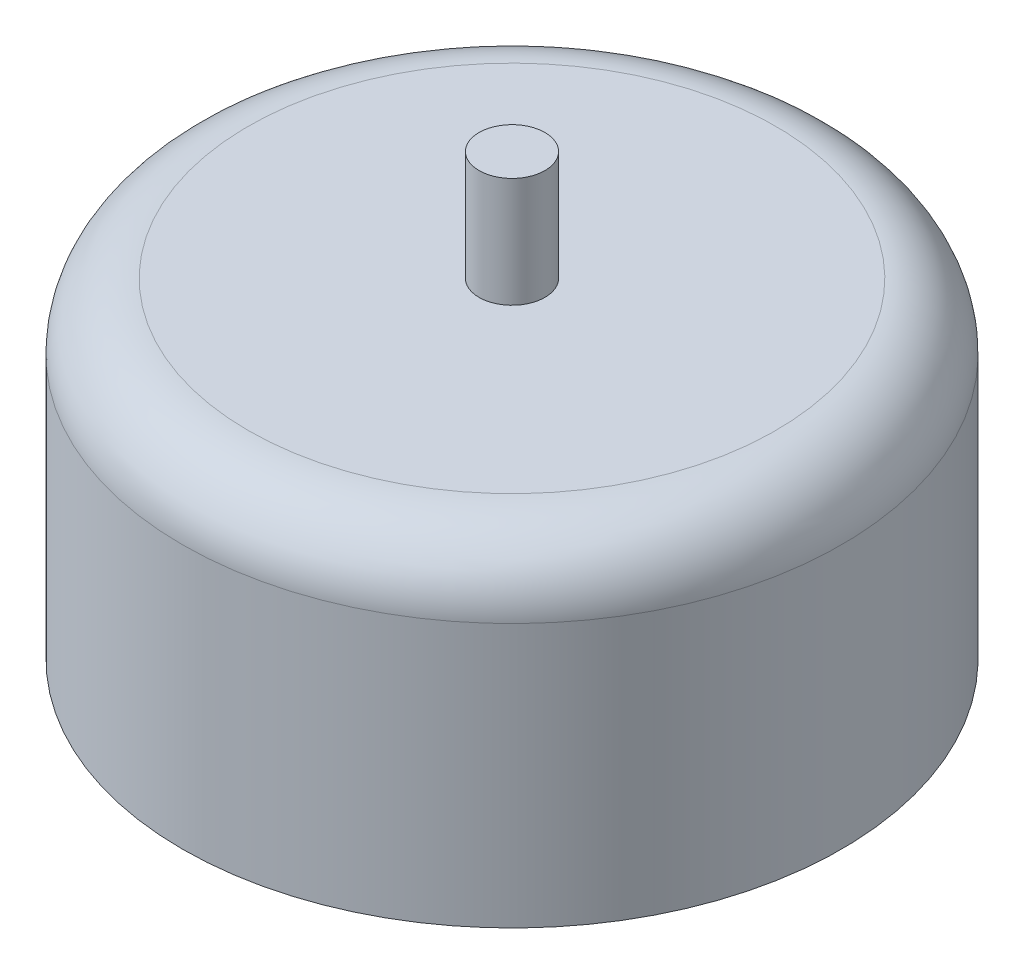
ISO-10303-21;
HEADER;
FILE_DESCRIPTION(('STEP AP214'),'2;1');
FILE_NAME('part.step','',(''),(''),'','','');
FILE_SCHEMA(('AUTOMOTIVE_DESIGN { 1 0 10303 214 1 1 1 1 }'));
ENDSEC;
DATA;
#1=APPLICATION_CONTEXT('core data for automotive mechanical design processes');
#2=APPLICATION_PROTOCOL_DEFINITION('international standard','automotive_design',2000,#1);
#3=PRODUCT_CONTEXT('',#1,'mechanical');
#4=PRODUCT('Part','Part','',(#3));
#5=PRODUCT_RELATED_PRODUCT_CATEGORY('part','',(#4));
#6=PRODUCT_DEFINITION_FORMATION('','',#4);
#7=PRODUCT_DEFINITION_CONTEXT('part definition',#1,'design');
#8=PRODUCT_DEFINITION('design','',#6,#7);
#9=PRODUCT_DEFINITION_SHAPE('','',#8);
#10=(LENGTH_UNIT() NAMED_UNIT(*) SI_UNIT(.MILLI.,.METRE.));
#11=(NAMED_UNIT(*) PLANE_ANGLE_UNIT() SI_UNIT($,.RADIAN.));
#12=(NAMED_UNIT(*) SI_UNIT($,.STERADIAN.) SOLID_ANGLE_UNIT());
#13=UNCERTAINTY_MEASURE_WITH_UNIT(LENGTH_MEASURE(1.E-05),#10,'distance_accuracy_value','');
#14=(GEOMETRIC_REPRESENTATION_CONTEXT(3) GLOBAL_UNCERTAINTY_ASSIGNED_CONTEXT((#13)) GLOBAL_UNIT_ASSIGNED_CONTEXT((#10,
#11,#12)) REPRESENTATION_CONTEXT('',''));
#15=CARTESIAN_POINT('',(0.,0.,0.));
#16=DIRECTION('',(0.,0.,1.));
#17=DIRECTION('',(1.,0.,0.));
#18=AXIS2_PLACEMENT_3D('',#15,#16,#17);
#19=CARTESIAN_POINT('',(0.,15.,0.));
#20=DIRECTION('',(0.,-1.,0.));
#21=DIRECTION('',(0.,0.,-1.));
#22=AXIS2_PLACEMENT_3D('',#19,#20,#21);
#23=CYLINDRICAL_SURFACE('',#22,15.);
#24=CARTESIAN_POINT('',(0.,12.,0.));
#25=DIRECTION('',(0.,1.,0.));
#26=DIRECTION('',(0.,0.,1.));
#27=AXIS2_PLACEMENT_3D('',#24,#25,#26);
#28=CIRCLE('',#27,15.);
#29=CARTESIAN_POINT('',(0.,12.,15.));
#30=VERTEX_POINT('',#29);
#31=EDGE_CURVE('E61',#30,#30,#28,.F.);
#32=ORIENTED_EDGE('',*,*,#31,.T.);
#33=EDGE_LOOP('',(#32));
#34=FACE_BOUND('',#33,.T.);
#35=CARTESIAN_POINT('',(0.,0.,0.));
#36=DIRECTION('',(0.,1.,0.));
#37=DIRECTION('',(0.,0.,1.));
#38=AXIS2_PLACEMENT_3D('',#35,#36,#37);
#39=CIRCLE('',#38,15.);
#40=CARTESIAN_POINT('',(0.,0.,15.));
#41=VERTEX_POINT('',#40);
#42=EDGE_CURVE('E69',#41,#41,#39,.T.);
#43=ORIENTED_EDGE('',*,*,#42,.T.);
#44=EDGE_LOOP('',(#43));
#45=FACE_BOUND('',#44,.T.);
#46=ADVANCED_FACE('F37',(#34,#45),#23,.T.);
#47=CARTESIAN_POINT('',(0.,15.,0.));
#48=DIRECTION('',(0.,1.,0.));
#49=DIRECTION('',(0.,0.,1.));
#50=AXIS2_PLACEMENT_3D('',#47,#48,#49);
#51=PLANE('',#50);
#52=CARTESIAN_POINT('',(0.,15.,0.));
#53=DIRECTION('',(0.,1.,0.));
#54=DIRECTION('',(0.,0.,1.));
#55=AXIS2_PLACEMENT_3D('',#52,#53,#54);
#56=CIRCLE('',#55,1.5);
#57=CARTESIAN_POINT('',(0.,15.,1.5));
#58=VERTEX_POINT('',#57);
#59=EDGE_CURVE('E74',#58,#58,#56,.T.);
#60=ORIENTED_EDGE('',*,*,#59,.F.);
#61=EDGE_LOOP('',(#60));
#62=FACE_BOUND('',#61,.T.);
#63=CARTESIAN_POINT('',(0.,15.,0.));
#64=DIRECTION('',(0.,1.,0.));
#65=DIRECTION('',(0.,0.,1.));
#66=AXIS2_PLACEMENT_3D('',#63,#64,#65);
#67=CIRCLE('',#66,12.);
#68=CARTESIAN_POINT('',(0.,15.,12.));
#69=VERTEX_POINT('',#68);
#70=EDGE_CURVE('E65',#69,#69,#67,.T.);
#71=ORIENTED_EDGE('',*,*,#70,.T.);
#72=EDGE_LOOP('',(#71));
#73=FACE_BOUND('',#72,.T.);
#74=ADVANCED_FACE('F113',(#62,#73),#51,.T.);
#75=CARTESIAN_POINT('',(0.,0.,0.));
#76=DIRECTION('',(0.,1.,0.));
#77=DIRECTION('',(0.,0.,1.));
#78=AXIS2_PLACEMENT_3D('',#75,#76,#77);
#79=PLANE('',#78);
#80=CARTESIAN_POINT('',(0.,0.,-5.));
#81=DIRECTION('',(0.,1.,0.));
#82=DIRECTION('',(0.,0.,1.));
#83=AXIS2_PLACEMENT_3D('',#80,#81,#82);
#84=CIRCLE('',#83,1.5);
#85=CARTESIAN_POINT('',(0.,0.,-3.5));
#86=VERTEX_POINT('',#85);
#87=EDGE_CURVE('E10',#86,#86,#84,.F.);
#88=ORIENTED_EDGE('',*,*,#87,.F.);
#89=EDGE_LOOP('',(#88));
#90=FACE_BOUND('',#89,.T.);
#91=CARTESIAN_POINT('',(5.,0.,0.));
#92=DIRECTION('',(0.,1.,0.));
#93=DIRECTION('',(0.,0.,1.));
#94=AXIS2_PLACEMENT_3D('',#91,#92,#93);
#95=CIRCLE('',#94,1.5);
#96=CARTESIAN_POINT('',(5.,0.,1.5));
#97=VERTEX_POINT('',#96);
#98=EDGE_CURVE('E45',#97,#97,#95,.F.);
#99=ORIENTED_EDGE('',*,*,#98,.F.);
#100=EDGE_LOOP('',(#99));
#101=FACE_BOUND('',#100,.T.);
#102=CARTESIAN_POINT('',(-5.,0.,0.));
#103=DIRECTION('',(0.,1.,0.));
#104=DIRECTION('',(0.,0.,1.));
#105=AXIS2_PLACEMENT_3D('',#102,#103,#104);
#106=CIRCLE('',#105,1.5);
#107=CARTESIAN_POINT('',(-5.,0.,1.5));
#108=VERTEX_POINT('',#107);
#109=EDGE_CURVE('E50',#108,#108,#106,.F.);
#110=ORIENTED_EDGE('',*,*,#109,.F.);
#111=EDGE_LOOP('',(#110));
#112=FACE_BOUND('',#111,.T.);
#113=CARTESIAN_POINT('',(0.,0.,5.));
#114=DIRECTION('',(0.,1.,0.));
#115=DIRECTION('',(0.,0.,1.));
#116=AXIS2_PLACEMENT_3D('',#113,#114,#115);
#117=CIRCLE('',#116,1.5);
#118=CARTESIAN_POINT('',(0.,0.,6.5));
#119=VERTEX_POINT('',#118);
#120=EDGE_CURVE('E55',#119,#119,#117,.F.);
#121=ORIENTED_EDGE('',*,*,#120,.F.);
#122=EDGE_LOOP('',(#121));
#123=FACE_BOUND('',#122,.T.);
#124=ORIENTED_EDGE('',*,*,#42,.F.);
#125=EDGE_LOOP('',(#124));
#126=FACE_BOUND('',#125,.T.);
#127=ADVANCED_FACE('F118',(#90,#101,#112,#123,#126),#79,.F.);
#128=CARTESIAN_POINT('',(0.,12.,0.));
#129=DIRECTION('',(0.,1.,0.));
#130=DIRECTION('',(0.,0.,1.));
#131=AXIS2_PLACEMENT_3D('',#128,#129,#130);
#132=TOROIDAL_SURFACE('',#131,12.,3.);
#133=ORIENTED_EDGE('',*,*,#31,.F.);
#134=EDGE_LOOP('',(#133));
#135=FACE_BOUND('',#134,.T.);
#136=ORIENTED_EDGE('',*,*,#70,.F.);
#137=EDGE_LOOP('',(#136));
#138=FACE_BOUND('',#137,.T.);
#139=ADVANCED_FACE('F39',(#135,#138),#132,.T.);
#140=CARTESIAN_POINT('',(0.,20.,0.));
#141=DIRECTION('',(0.,-1.,0.));
#142=DIRECTION('',(0.,0.,-1.));
#143=AXIS2_PLACEMENT_3D('',#140,#141,#142);
#144=CYLINDRICAL_SURFACE('',#143,1.5);
#145=CARTESIAN_POINT('',(0.,20.,0.));
#146=DIRECTION('',(0.,1.,0.));
#147=DIRECTION('',(0.,0.,1.));
#148=AXIS2_PLACEMENT_3D('',#145,#146,#147);
#149=CIRCLE('',#148,1.5);
#150=CARTESIAN_POINT('',(0.,20.,1.5));
#151=VERTEX_POINT('',#150);
#152=EDGE_CURVE('E73',#151,#151,#149,.T.);
#153=ORIENTED_EDGE('',*,*,#152,.F.);
#154=EDGE_LOOP('',(#153));
#155=FACE_BOUND('',#154,.T.);
#156=ORIENTED_EDGE('',*,*,#59,.T.);
#157=EDGE_LOOP('',(#156));
#158=FACE_BOUND('',#157,.T.);
#159=ADVANCED_FACE('F126',(#155,#158),#144,.T.);
#160=CARTESIAN_POINT('',(0.,20.,0.));
#161=DIRECTION('',(0.,1.,0.));
#162=DIRECTION('',(0.,0.,1.));
#163=AXIS2_PLACEMENT_3D('',#160,#161,#162);
#164=PLANE('',#163);
#165=ORIENTED_EDGE('',*,*,#152,.T.);
#166=EDGE_LOOP('',(#165));
#167=FACE_BOUND('',#166,.T.);
#168=ADVANCED_FACE('F129',(#167),#164,.T.);
#169=CARTESIAN_POINT('',(0.,-2.,5.));
#170=DIRECTION('',(0.,1.,0.));
#171=DIRECTION('',(0.,0.,1.));
#172=AXIS2_PLACEMENT_3D('',#169,#170,#171);
#173=CYLINDRICAL_SURFACE('',#172,1.5);
#174=CARTESIAN_POINT('',(0.,-2.,5.));
#175=DIRECTION('',(0.,-1.,0.));
#176=DIRECTION('',(0.,0.,-1.));
#177=AXIS2_PLACEMENT_3D('',#174,#175,#176);
#178=CIRCLE('',#177,1.5);
#179=CARTESIAN_POINT('',(0.,-2.,3.5));
#180=VERTEX_POINT('',#179);
#181=EDGE_CURVE('E78',#180,#180,#178,.T.);
#182=ORIENTED_EDGE('',*,*,#181,.F.);
#183=EDGE_LOOP('',(#182));
#184=FACE_BOUND('',#183,.T.);
#185=ORIENTED_EDGE('',*,*,#120,.T.);
#186=EDGE_LOOP('',(#185));
#187=FACE_BOUND('',#186,.T.);
#188=ADVANCED_FACE('F133',(#184,#187),#173,.T.);
#189=CARTESIAN_POINT('',(0.,-2.,5.));
#190=DIRECTION('',(0.,-1.,0.));
#191=DIRECTION('',(0.,0.,-1.));
#192=AXIS2_PLACEMENT_3D('',#189,#190,#191);
#193=PLANE('',#192);
#194=ORIENTED_EDGE('',*,*,#181,.T.);
#195=EDGE_LOOP('',(#194));
#196=FACE_BOUND('',#195,.T.);
#197=ADVANCED_FACE('F137',(#196),#193,.T.);
#198=CARTESIAN_POINT('',(-5.,-2.,0.));
#199=DIRECTION('',(0.,1.,0.));
#200=DIRECTION('',(0.,0.,1.));
#201=AXIS2_PLACEMENT_3D('',#198,#199,#200);
#202=CYLINDRICAL_SURFACE('',#201,1.5);
#203=CARTESIAN_POINT('',(-5.,-2.,0.));
#204=DIRECTION('',(0.,-1.,0.));
#205=DIRECTION('',(0.,0.,-1.));
#206=AXIS2_PLACEMENT_3D('',#203,#204,#205);
#207=CIRCLE('',#206,1.5);
#208=CARTESIAN_POINT('',(-5.,-2.,-1.5));
#209=VERTEX_POINT('',#208);
#210=EDGE_CURVE('E85',#209,#209,#207,.T.);
#211=ORIENTED_EDGE('',*,*,#210,.F.);
#212=EDGE_LOOP('',(#211));
#213=FACE_BOUND('',#212,.T.);
#214=ORIENTED_EDGE('',*,*,#109,.T.);
#215=EDGE_LOOP('',(#214));
#216=FACE_BOUND('',#215,.T.);
#217=ADVANCED_FACE('F141',(#213,#216),#202,.T.);
#218=CARTESIAN_POINT('',(-5.,-2.,0.));
#219=DIRECTION('',(0.,-1.,0.));
#220=DIRECTION('',(0.,0.,-1.));
#221=AXIS2_PLACEMENT_3D('',#218,#219,#220);
#222=PLANE('',#221);
#223=ORIENTED_EDGE('',*,*,#210,.T.);
#224=EDGE_LOOP('',(#223));
#225=FACE_BOUND('',#224,.T.);
#226=ADVANCED_FACE('F145',(#225),#222,.T.);
#227=CARTESIAN_POINT('',(5.,-2.,0.));
#228=DIRECTION('',(0.,1.,0.));
#229=DIRECTION('',(0.,0.,1.));
#230=AXIS2_PLACEMENT_3D('',#227,#228,#229);
#231=CYLINDRICAL_SURFACE('',#230,1.5);
#232=CARTESIAN_POINT('',(5.,-2.,0.));
#233=DIRECTION('',(0.,-1.,0.));
#234=DIRECTION('',(0.,0.,-1.));
#235=AXIS2_PLACEMENT_3D('',#232,#233,#234);
#236=CIRCLE('',#235,1.5);
#237=CARTESIAN_POINT('',(5.,-2.,-1.5));
#238=VERTEX_POINT('',#237);
#239=EDGE_CURVE('E89',#238,#238,#236,.T.);
#240=ORIENTED_EDGE('',*,*,#239,.F.);
#241=EDGE_LOOP('',(#240));
#242=FACE_BOUND('',#241,.T.);
#243=ORIENTED_EDGE('',*,*,#98,.T.);
#244=EDGE_LOOP('',(#243));
#245=FACE_BOUND('',#244,.T.);
#246=ADVANCED_FACE('F109',(#242,#245),#231,.T.);
#247=CARTESIAN_POINT('',(5.,-2.,0.));
#248=DIRECTION('',(0.,-1.,0.));
#249=DIRECTION('',(0.,0.,-1.));
#250=AXIS2_PLACEMENT_3D('',#247,#248,#249);
#251=PLANE('',#250);
#252=ORIENTED_EDGE('',*,*,#239,.T.);
#253=EDGE_LOOP('',(#252));
#254=FACE_BOUND('',#253,.T.);
#255=ADVANCED_FACE('F102',(#254),#251,.T.);
#256=CARTESIAN_POINT('',(0.,-2.,-5.));
#257=DIRECTION('',(0.,1.,0.));
#258=DIRECTION('',(0.,0.,1.));
#259=AXIS2_PLACEMENT_3D('',#256,#257,#258);
#260=CYLINDRICAL_SURFACE('',#259,1.5);
#261=CARTESIAN_POINT('',(0.,-2.,-5.));
#262=DIRECTION('',(0.,-1.,0.));
#263=DIRECTION('',(0.,0.,-1.));
#264=AXIS2_PLACEMENT_3D('',#261,#262,#263);
#265=CIRCLE('',#264,1.5);
#266=CARTESIAN_POINT('',(0.,-2.,-6.5));
#267=VERTEX_POINT('',#266);
#268=EDGE_CURVE('E93',#267,#267,#265,.T.);
#269=ORIENTED_EDGE('',*,*,#268,.F.);
#270=EDGE_LOOP('',(#269));
#271=FACE_BOUND('',#270,.T.);
#272=ORIENTED_EDGE('',*,*,#87,.T.);
#273=EDGE_LOOP('',(#272));
#274=FACE_BOUND('',#273,.T.);
#275=ADVANCED_FACE('F100',(#271,#274),#260,.T.);
#276=CARTESIAN_POINT('',(0.,-2.,-5.));
#277=DIRECTION('',(0.,-1.,0.));
#278=DIRECTION('',(0.,0.,-1.));
#279=AXIS2_PLACEMENT_3D('',#276,#277,#278);
#280=PLANE('',#279);
#281=ORIENTED_EDGE('',*,*,#268,.T.);
#282=EDGE_LOOP('',(#281));
#283=FACE_BOUND('',#282,.T.);
#284=ADVANCED_FACE('F98',(#283),#280,.T.);
#285=CLOSED_SHELL('',(#46,#74,#127,#139,#159,#168,#188,#197,#217,#226,#246,#255,#275,#284));
#286=MANIFOLD_SOLID_BREP('B2',#285);
#287=ADVANCED_BREP_SHAPE_REPRESENTATION('',(#18,#286),#14);
#288=SHAPE_DEFINITION_REPRESENTATION(#9,#287);
ENDSEC;
END-ISO-10303-21;
